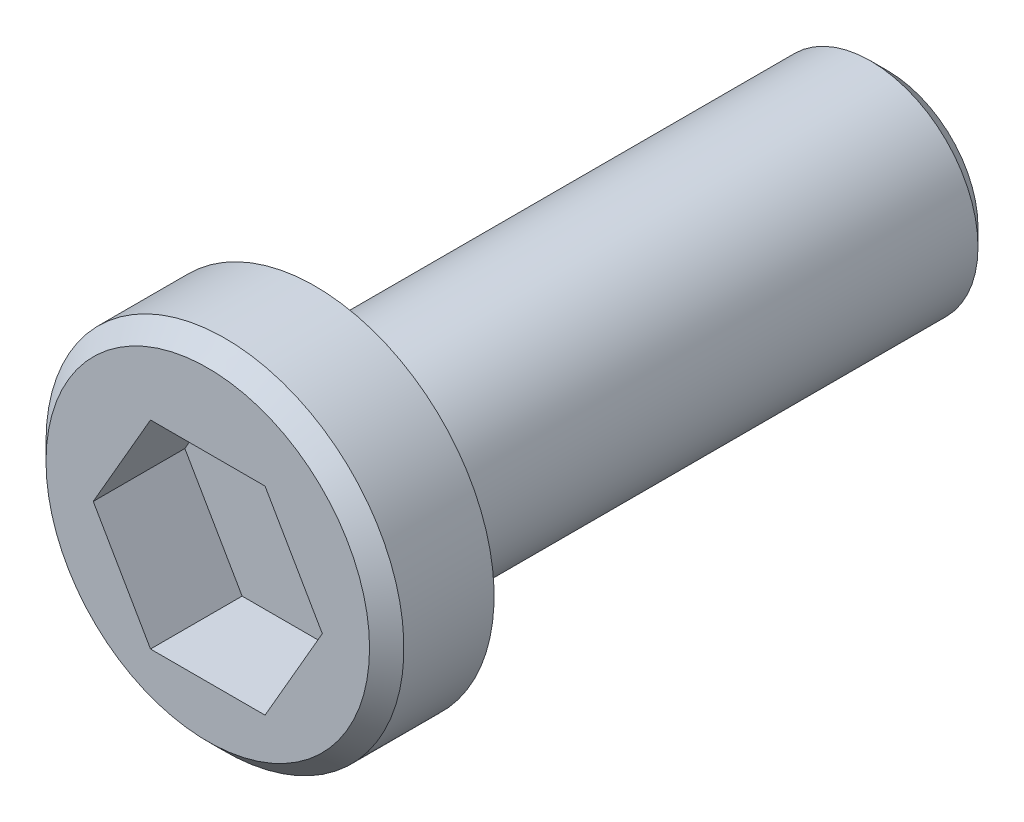
ISO-10303-21;
HEADER;
FILE_DESCRIPTION(('STEP AP214'),'2;1');
FILE_NAME('part.step','',(''),(''),'','','');
FILE_SCHEMA(('AUTOMOTIVE_DESIGN { 1 0 10303 214 1 1 1 1 }'));
ENDSEC;
DATA;
#1=APPLICATION_CONTEXT('core data for automotive mechanical design processes');
#2=APPLICATION_PROTOCOL_DEFINITION('international standard','automotive_design',2000,#1);
#3=PRODUCT_CONTEXT('',#1,'mechanical');
#4=PRODUCT('Part','Part','',(#3));
#5=PRODUCT_RELATED_PRODUCT_CATEGORY('part','',(#4));
#6=PRODUCT_DEFINITION_FORMATION('','',#4);
#7=PRODUCT_DEFINITION_CONTEXT('part definition',#1,'design');
#8=PRODUCT_DEFINITION('design','',#6,#7);
#9=PRODUCT_DEFINITION_SHAPE('','',#8);
#10=(LENGTH_UNIT() NAMED_UNIT(*) SI_UNIT(.MILLI.,.METRE.));
#11=(NAMED_UNIT(*) PLANE_ANGLE_UNIT() SI_UNIT($,.RADIAN.));
#12=(NAMED_UNIT(*) SI_UNIT($,.STERADIAN.) SOLID_ANGLE_UNIT());
#13=UNCERTAINTY_MEASURE_WITH_UNIT(LENGTH_MEASURE(1.E-05),#10,'distance_accuracy_value','');
#14=(GEOMETRIC_REPRESENTATION_CONTEXT(3) GLOBAL_UNCERTAINTY_ASSIGNED_CONTEXT((#13)) GLOBAL_UNIT_ASSIGNED_CONTEXT((#10,
#11,#12)) REPRESENTATION_CONTEXT('',''));
#15=CARTESIAN_POINT('',(0.,0.,0.));
#16=DIRECTION('',(0.,0.,1.));
#17=DIRECTION('',(1.,0.,0.));
#18=AXIS2_PLACEMENT_3D('',#15,#16,#17);
#19=CARTESIAN_POINT('',(0.,0.,25.4));
#20=DIRECTION('',(0.,0.,-1.));
#21=DIRECTION('',(-1.,0.,0.));
#22=AXIS2_PLACEMENT_3D('',#19,#20,#21);
#23=CYLINDRICAL_SURFACE('',#22,4.7625);
#24=CARTESIAN_POINT('',(0.,0.,0.761999999999999));
#25=DIRECTION('',(0.,0.,1.));
#26=DIRECTION('',(1.,0.,0.));
#27=AXIS2_PLACEMENT_3D('',#24,#25,#26);
#28=CIRCLE('',#27,4.7625);
#29=CARTESIAN_POINT('',(4.7625,0.,0.761999999999999));
#30=VERTEX_POINT('',#29);
#31=EDGE_CURVE('E161',#30,#30,#28,.T.);
#32=ORIENTED_EDGE('',*,*,#31,.T.);
#33=EDGE_LOOP('',(#32));
#34=FACE_BOUND('',#33,.T.);
#35=CARTESIAN_POINT('',(0.,0.,25.4));
#36=DIRECTION('',(0.,0.,1.));
#37=DIRECTION('',(1.,0.,0.));
#38=AXIS2_PLACEMENT_3D('',#35,#36,#37);
#39=CIRCLE('',#38,4.7625);
#40=CARTESIAN_POINT('',(4.7625,0.,25.4));
#41=VERTEX_POINT('',#40);
#42=EDGE_CURVE('E158',#41,#41,#39,.T.);
#43=ORIENTED_EDGE('',*,*,#42,.F.);
#44=EDGE_LOOP('',(#43));
#45=FACE_BOUND('',#44,.T.);
#46=ADVANCED_FACE('F46',(#34,#45),#23,.T.);
#47=CARTESIAN_POINT('',(0.,0.,0.));
#48=DIRECTION('',(0.,0.,1.));
#49=DIRECTION('',(1.,0.,0.));
#50=AXIS2_PLACEMENT_3D('',#47,#48,#49);
#51=PLANE('',#50);
#52=CARTESIAN_POINT('',(0.,0.,0.));
#53=DIRECTION('',(0.,0.,1.));
#54=DIRECTION('',(1.,0.,0.));
#55=AXIS2_PLACEMENT_3D('',#52,#53,#54);
#56=CIRCLE('',#55,4.0005);
#57=CARTESIAN_POINT('',(4.0005,0.,0.));
#58=VERTEX_POINT('',#57);
#59=EDGE_CURVE('E164',#58,#58,#56,.F.);
#60=ORIENTED_EDGE('',*,*,#59,.T.);
#61=EDGE_LOOP('',(#60));
#62=FACE_BOUND('',#61,.T.);
#63=ADVANCED_FACE('F185',(#62),#51,.F.);
#64=CARTESIAN_POINT('',(0.,0.491553117569765,25.4));
#65=DIRECTION('',(0.,0.,1.));
#66=DIRECTION('',(1.,0.,0.));
#67=AXIS2_PLACEMENT_3D('',#64,#65,#66);
#68=PLANE('',#67);
#69=CARTESIAN_POINT('',(0.,0.491553117569765,25.4));
#70=DIRECTION('',(0.,0.,1.));
#71=DIRECTION('',(1.,0.,0.));
#72=AXIS2_PLACEMENT_3D('',#69,#70,#71);
#73=CIRCLE('',#72,7.9375);
#74=CARTESIAN_POINT('',(-7.9375,0.491553117569765,25.4));
#75=VERTEX_POINT('',#74);
#76=EDGE_CURVE('E149',#75,#75,#73,.T.);
#77=ORIENTED_EDGE('',*,*,#76,.F.);
#78=EDGE_LOOP('',(#77));
#79=FACE_BOUND('',#78,.T.);
#80=ORIENTED_EDGE('',*,*,#42,.T.);
#81=EDGE_LOOP('',(#80));
#82=FACE_BOUND('',#81,.T.);
#83=ADVANCED_FACE('F190',(#79,#82),#68,.F.);
#84=CARTESIAN_POINT('',(0.,0.491553117569765,30.1625));
#85=DIRECTION('',(0.,0.,-1.));
#86=DIRECTION('',(-1.,0.,0.));
#87=AXIS2_PLACEMENT_3D('',#84,#85,#86);
#88=CYLINDRICAL_SURFACE('',#87,7.9375);
#89=CARTESIAN_POINT('',(0.,0.491553117569765,29.4005));
#90=DIRECTION('',(0.,0.,1.));
#91=DIRECTION('',(1.,0.,0.));
#92=AXIS2_PLACEMENT_3D('',#89,#90,#91);
#93=CIRCLE('',#92,7.9375);
#94=CARTESIAN_POINT('',(-7.9375,0.491553117569765,29.4005));
#95=VERTEX_POINT('',#94);
#96=EDGE_CURVE('E13',#95,#95,#93,.F.);
#97=CARTESIAN_POINT('',(-7.9375,0.491553117569765,29.4005));
#98=CARTESIAN_POINT('',(-7.9375,0.491553117569765,29.358828125));
#99=CARTESIAN_POINT('',(-7.9375,0.491553117569765,29.31715625));
#100=CARTESIAN_POINT('',(-7.9375,0.491553117569765,29.2338125));
#101=CARTESIAN_POINT('',(-7.9375,0.491553117569765,29.192140625));
#102=CARTESIAN_POINT('',(-7.9375,0.491553117569765,29.108796875));
#103=CARTESIAN_POINT('',(-7.9375,0.491553117569765,29.067125));
#104=CARTESIAN_POINT('',(-7.9375,0.491553117569765,28.98378125));
#105=CARTESIAN_POINT('',(-7.9375,0.491553117569765,28.942109375));
#106=CARTESIAN_POINT('',(-7.9375,0.491553117569765,28.858765625));
#107=CARTESIAN_POINT('',(-7.9375,0.491553117569765,28.81709375));
#108=CARTESIAN_POINT('',(-7.9375,0.491553117569765,28.73375));
#109=CARTESIAN_POINT('',(-7.9375,0.491553117569765,28.692078125));
#110=CARTESIAN_POINT('',(-7.9375,0.491553117569765,28.608734375));
#111=CARTESIAN_POINT('',(-7.9375,0.491553117569765,28.5670625));
#112=CARTESIAN_POINT('',(-7.9375,0.491553117569765,28.48371875));
#113=CARTESIAN_POINT('',(-7.9375,0.491553117569765,28.442046875));
#114=CARTESIAN_POINT('',(-7.9375,0.491553117569765,28.358703125));
#115=CARTESIAN_POINT('',(-7.9375,0.491553117569765,28.31703125));
#116=CARTESIAN_POINT('',(-7.9375,0.491553117569765,28.2336875));
#117=CARTESIAN_POINT('',(-7.9375,0.491553117569765,28.192015625));
#118=CARTESIAN_POINT('',(-7.9375,0.491553117569765,28.108671875));
#119=CARTESIAN_POINT('',(-7.9375,0.491553117569765,28.067));
#120=CARTESIAN_POINT('',(-7.9375,0.491553117569765,27.98365625));
#121=CARTESIAN_POINT('',(-7.9375,0.491553117569765,27.941984375));
#122=CARTESIAN_POINT('',(-7.9375,0.491553117569765,27.858640625));
#123=CARTESIAN_POINT('',(-7.9375,0.491553117569765,27.81696875));
#124=CARTESIAN_POINT('',(-7.9375,0.491553117569765,27.733625));
#125=CARTESIAN_POINT('',(-7.9375,0.491553117569765,27.691953125));
#126=CARTESIAN_POINT('',(-7.9375,0.491553117569765,27.608609375));
#127=CARTESIAN_POINT('',(-7.9375,0.491553117569765,27.5669375));
#128=CARTESIAN_POINT('',(-7.9375,0.491553117569765,27.48359375));
#129=CARTESIAN_POINT('',(-7.9375,0.491553117569765,27.441921875));
#130=CARTESIAN_POINT('',(-7.9375,0.491553117569765,27.358578125));
#131=CARTESIAN_POINT('',(-7.9375,0.491553117569765,27.31690625));
#132=CARTESIAN_POINT('',(-7.9375,0.491553117569765,27.2335625));
#133=CARTESIAN_POINT('',(-7.9375,0.491553117569765,27.191890625));
#134=CARTESIAN_POINT('',(-7.9375,0.491553117569765,27.108546875));
#135=CARTESIAN_POINT('',(-7.9375,0.491553117569765,27.066875));
#136=CARTESIAN_POINT('',(-7.9375,0.491553117569765,26.98353125));
#137=CARTESIAN_POINT('',(-7.9375,0.491553117569765,26.941859375));
#138=CARTESIAN_POINT('',(-7.9375,0.491553117569765,26.858515625));
#139=CARTESIAN_POINT('',(-7.9375,0.491553117569765,26.81684375));
#140=CARTESIAN_POINT('',(-7.9375,0.491553117569765,26.7335));
#141=CARTESIAN_POINT('',(-7.9375,0.491553117569765,26.691828125));
#142=CARTESIAN_POINT('',(-7.9375,0.491553117569765,26.608484375));
#143=CARTESIAN_POINT('',(-7.9375,0.491553117569765,26.5668125));
#144=CARTESIAN_POINT('',(-7.9375,0.491553117569765,26.48346875));
#145=CARTESIAN_POINT('',(-7.9375,0.491553117569765,26.441796875));
#146=CARTESIAN_POINT('',(-7.9375,0.491553117569765,26.358453125));
#147=CARTESIAN_POINT('',(-7.9375,0.491553117569765,26.31678125));
#148=CARTESIAN_POINT('',(-7.9375,0.491553117569765,26.2334375));
#149=CARTESIAN_POINT('',(-7.9375,0.491553117569765,26.191765625));
#150=CARTESIAN_POINT('',(-7.9375,0.491553117569765,26.108421875));
#151=CARTESIAN_POINT('',(-7.9375,0.491553117569765,26.06675));
#152=CARTESIAN_POINT('',(-7.9375,0.491553117569765,25.98340625));
#153=CARTESIAN_POINT('',(-7.9375,0.491553117569765,25.941734375));
#154=CARTESIAN_POINT('',(-7.9375,0.491553117569765,25.858390625));
#155=CARTESIAN_POINT('',(-7.9375,0.491553117569765,25.81671875));
#156=CARTESIAN_POINT('',(-7.9375,0.491553117569765,25.733375));
#157=CARTESIAN_POINT('',(-7.9375,0.491553117569765,25.691703125));
#158=CARTESIAN_POINT('',(-7.9375,0.491553117569765,25.608359375));
#159=CARTESIAN_POINT('',(-7.9375,0.491553117569765,25.5666875));
#160=CARTESIAN_POINT('',(-7.9375,0.491553117569765,25.48334375));
#161=CARTESIAN_POINT('',(-7.9375,0.491553117569765,25.441671875));
#162=CARTESIAN_POINT('',(-7.9375,0.491553117569765,25.4));
#163=B_SPLINE_CURVE_WITH_KNOTS('',3,(#97,#98,#99,#100,#101,#102,#103,#104,#105,#106,#107,#108,
#109,#110,#111,#112,#113,#114,#115,#116,#117,#118,#119,#120,#121,#122,#123,#124,#125,#126,#127,
#128,#129,#130,#131,#132,#133,#134,#135,#136,#137,#138,#139,#140,#141,#142,#143,#144,#145,#146,
#147,#148,#149,#150,#151,#152,#153,#154,#155,#156,#157,#158,#159,#160,#161,#162),.UNSPECIFIED.,
.F.,.F.,(4,2,2,2,2,2,2,2,2,2,2,2,2,2,2,2,2,2,2,2,2,2,2,2,2,2,2,2,2,2,2,2,4),(0.,
0.125015625000002,0.250031250000001,0.375046875000003,0.500062500000002,0.625078125000001,
0.750093750000003,0.875109375000002,1.000125,1.125140625,1.25015625,1.375171875,1.5001875,
1.625203125,1.75021875,1.875234375,2.00025,2.125265625,2.25028125,2.375296875,2.5003125,
2.625328125,2.75034375,2.875359375,3.000375,3.125390625,3.25040625,3.375421875,3.5004375,
3.625453125,3.75046875,3.875484375,4.0005),.UNSPECIFIED.);
#164=EDGE_CURVE('BSEAM197',#95,#75,#163,.T.);
#165=ORIENTED_EDGE('',*,*,#96,.T.);
#166=ORIENTED_EDGE('',*,*,#76,.T.);
#167=ORIENTED_EDGE('',*,*,#164,.T.);
#168=ORIENTED_EDGE('',*,*,#164,.F.);
#169=EDGE_LOOP('',(#165,#167,#166,#168));
#170=FACE_BOUND('',#169,.T.);
#171=ADVANCED_FACE('F197',(#170),#88,.T.);
#172=CARTESIAN_POINT('',(0.,0.491553117569765,30.1625));
#173=DIRECTION('',(0.,0.,1.));
#174=DIRECTION('',(1.,0.,0.));
#175=AXIS2_PLACEMENT_3D('',#172,#173,#174);
#176=PLANE('',#175);
#177=DIRECTION('',(1.,0.,0.));
#178=VECTOR('',#177,1.);
#179=CARTESIAN_POINT('',(-2.54,-4.39940905122495,30.1625));
#180=LINE('',#179,#178);
#181=CARTESIAN_POINT('',(-2.54,-4.39940905122495,30.1625));
#182=VERTEX_POINT('',#181);
#183=CARTESIAN_POINT('',(2.54,-4.39940905122495,30.1625));
#184=VERTEX_POINT('',#183);
#185=EDGE_CURVE('E131',#182,#184,#180,.T.);
#186=ORIENTED_EDGE('',*,*,#185,.F.);
#187=DIRECTION('',(0.5,-0.866025403784438,0.));
#188=VECTOR('',#187,1.);
#189=CARTESIAN_POINT('',(-5.08,0.,30.1625));
#190=LINE('',#189,#188);
#191=CARTESIAN_POINT('',(-5.08,0.,30.1625));
#192=VERTEX_POINT('',#191);
#193=EDGE_CURVE('E125',#192,#182,#190,.T.);
#194=ORIENTED_EDGE('',*,*,#193,.F.);
#195=DIRECTION('',(-0.5,-0.866025403784439,0.));
#196=VECTOR('',#195,1.);
#197=CARTESIAN_POINT('',(-2.54,4.39940905122495,30.1625));
#198=LINE('',#197,#196);
#199=CARTESIAN_POINT('',(-2.54,4.39940905122495,30.1625));
#200=VERTEX_POINT('',#199);
#201=EDGE_CURVE('E123',#200,#192,#198,.T.);
#202=ORIENTED_EDGE('',*,*,#201,.F.);
#203=DIRECTION('',(-1.,0.,0.));
#204=VECTOR('',#203,1.);
#205=CARTESIAN_POINT('',(2.54,4.39940905122495,30.1625));
#206=LINE('',#205,#204);
#207=CARTESIAN_POINT('',(2.54,4.39940905122495,30.1625));
#208=VERTEX_POINT('',#207);
#209=EDGE_CURVE('E103',#208,#200,#206,.T.);
#210=ORIENTED_EDGE('',*,*,#209,.F.);
#211=DIRECTION('',(-0.5,0.866025403784438,0.));
#212=VECTOR('',#211,1.);
#213=CARTESIAN_POINT('',(5.08,0.,30.1625));
#214=LINE('',#213,#212);
#215=CARTESIAN_POINT('',(5.08,0.,30.1625));
#216=VERTEX_POINT('',#215);
#217=EDGE_CURVE('E114',#216,#208,#214,.T.);
#218=ORIENTED_EDGE('',*,*,#217,.F.);
#219=DIRECTION('',(0.499999999999999,0.866025403784439,0.));
#220=VECTOR('',#219,1.);
#221=CARTESIAN_POINT('',(2.54,-4.39940905122495,30.1625));
#222=LINE('',#221,#220);
#223=EDGE_CURVE('E60',#184,#216,#222,.T.);
#224=ORIENTED_EDGE('',*,*,#223,.F.);
#225=EDGE_LOOP('',(#186,#194,#202,#210,#218,#224));
#226=FACE_BOUND('',#225,.T.);
#227=CARTESIAN_POINT('',(0.,0.491553117569765,30.1625));
#228=DIRECTION('',(0.,0.,1.));
#229=DIRECTION('',(1.,0.,0.));
#230=AXIS2_PLACEMENT_3D('',#227,#228,#229);
#231=CIRCLE('',#230,7.1755);
#232=CARTESIAN_POINT('',(7.1755,0.491553117569765,30.1625));
#233=VERTEX_POINT('',#232);
#234=EDGE_CURVE('E53',#233,#233,#231,.T.);
#235=ORIENTED_EDGE('',*,*,#234,.T.);
#236=EDGE_LOOP('',(#235));
#237=FACE_BOUND('',#236,.T.);
#238=ADVANCED_FACE('F119',(#226,#237),#176,.T.);
#239=CARTESIAN_POINT('',(0.,0.,0.761999999999999));
#240=DIRECTION('',(0.,0.,1.));
#241=DIRECTION('',(1.,0.,0.));
#242=AXIS2_PLACEMENT_3D('',#239,#240,#241);
#243=CONICAL_SURFACE('',#242,4.7625,0.785398163397451);
#244=ORIENTED_EDGE('',*,*,#59,.F.);
#245=EDGE_LOOP('',(#244));
#246=FACE_BOUND('',#245,.T.);
#247=ORIENTED_EDGE('',*,*,#31,.F.);
#248=EDGE_LOOP('',(#247));
#249=FACE_BOUND('',#248,.T.);
#250=ADVANCED_FACE('F172',(#246,#249),#243,.T.);
#251=CARTESIAN_POINT('',(0.,0.491553117569765,30.1625));
#252=DIRECTION('',(0.,0.,-1.));
#253=DIRECTION('',(-1.,0.,0.));
#254=AXIS2_PLACEMENT_3D('',#251,#252,#253);
#255=CONICAL_SURFACE('',#254,7.1755,0.785398163397448);
#256=ORIENTED_EDGE('',*,*,#96,.F.);
#257=EDGE_LOOP('',(#256));
#258=FACE_BOUND('',#257,.T.);
#259=ORIENTED_EDGE('',*,*,#234,.F.);
#260=EDGE_LOOP('',(#259));
#261=FACE_BOUND('',#260,.T.);
#262=ADVANCED_FACE('F169',(#258,#261),#255,.T.);
#263=CARTESIAN_POINT('',(2.54,-4.39940905122495,26.0985));
#264=DIRECTION('',(0.866025403784439,-0.5,0.));
#265=DIRECTION('',(0.5,0.866025403784439,0.));
#266=AXIS2_PLACEMENT_3D('',#263,#264,#265);
#267=PLANE('',#266);
#268=ORIENTED_EDGE('',*,*,#223,.T.);
#269=DIRECTION('',(0.,0.,1.));
#270=VECTOR('',#269,1.);
#271=CARTESIAN_POINT('',(5.08,0.,26.0985));
#272=LINE('',#271,#270);
#273=CARTESIAN_POINT('',(5.08,0.,26.0985));
#274=VERTEX_POINT('',#273);
#275=EDGE_CURVE('E111',#274,#216,#272,.T.);
#276=ORIENTED_EDGE('',*,*,#275,.F.);
#277=DIRECTION('',(0.499999999999999,0.866025403784439,0.));
#278=VECTOR('',#277,1.);
#279=CARTESIAN_POINT('',(2.54,-4.39940905122495,26.0985));
#280=LINE('',#279,#278);
#281=CARTESIAN_POINT('',(2.54,-4.39940905122495,26.0985));
#282=VERTEX_POINT('',#281);
#283=EDGE_CURVE('E133',#282,#274,#280,.T.);
#284=ORIENTED_EDGE('',*,*,#283,.F.);
#285=DIRECTION('',(0.,0.,1.));
#286=VECTOR('',#285,1.);
#287=CARTESIAN_POINT('',(2.54,-4.39940905122495,26.0985));
#288=LINE('',#287,#286);
#289=EDGE_CURVE('E67',#282,#184,#288,.T.);
#290=ORIENTED_EDGE('',*,*,#289,.T.);
#291=EDGE_LOOP('',(#268,#276,#284,#290));
#292=FACE_BOUND('',#291,.T.);
#293=ADVANCED_FACE('F171',(#292),#267,.F.);
#294=CARTESIAN_POINT('',(-2.54,-4.39940905122495,26.0985));
#295=DIRECTION('',(0.,-1.,0.));
#296=DIRECTION('',(1.,0.,0.));
#297=AXIS2_PLACEMENT_3D('',#294,#295,#296);
#298=PLANE('',#297);
#299=ORIENTED_EDGE('',*,*,#185,.T.);
#300=ORIENTED_EDGE('',*,*,#289,.F.);
#301=DIRECTION('',(1.,0.,0.));
#302=VECTOR('',#301,1.);
#303=CARTESIAN_POINT('',(-2.54,-4.39940905122495,26.0985));
#304=LINE('',#303,#302);
#305=CARTESIAN_POINT('',(-2.54,-4.39940905122495,26.0985));
#306=VERTEX_POINT('',#305);
#307=EDGE_CURVE('E145',#306,#282,#304,.T.);
#308=ORIENTED_EDGE('',*,*,#307,.F.);
#309=DIRECTION('',(0.,0.,1.));
#310=VECTOR('',#309,1.);
#311=CARTESIAN_POINT('',(-2.54,-4.39940905122495,26.0985));
#312=LINE('',#311,#310);
#313=EDGE_CURVE('E150',#306,#182,#312,.T.);
#314=ORIENTED_EDGE('',*,*,#313,.T.);
#315=EDGE_LOOP('',(#299,#300,#308,#314));
#316=FACE_BOUND('',#315,.T.);
#317=ADVANCED_FACE('F179',(#316),#298,.F.);
#318=CARTESIAN_POINT('',(-5.08,0.,26.0985));
#319=DIRECTION('',(-0.866025403784439,-0.5,0.));
#320=DIRECTION('',(0.5,-0.866025403784439,0.));
#321=AXIS2_PLACEMENT_3D('',#318,#319,#320);
#322=PLANE('',#321);
#323=ORIENTED_EDGE('',*,*,#193,.T.);
#324=ORIENTED_EDGE('',*,*,#313,.F.);
#325=DIRECTION('',(0.5,-0.866025403784438,0.));
#326=VECTOR('',#325,1.);
#327=CARTESIAN_POINT('',(-5.08,0.,26.0985));
#328=LINE('',#327,#326);
#329=CARTESIAN_POINT('',(-5.08,0.,26.0985));
#330=VERTEX_POINT('',#329);
#331=EDGE_CURVE('E142',#330,#306,#328,.T.);
#332=ORIENTED_EDGE('',*,*,#331,.F.);
#333=DIRECTION('',(0.,0.,1.));
#334=VECTOR('',#333,1.);
#335=CARTESIAN_POINT('',(-5.08,0.,26.0985));
#336=LINE('',#335,#334);
#337=EDGE_CURVE('E152',#330,#192,#336,.T.);
#338=ORIENTED_EDGE('',*,*,#337,.T.);
#339=EDGE_LOOP('',(#323,#324,#332,#338));
#340=FACE_BOUND('',#339,.T.);
#341=ADVANCED_FACE('F238',(#340),#322,.F.);
#342=CARTESIAN_POINT('',(-2.54,4.39940905122495,26.0985));
#343=DIRECTION('',(-0.866025403784439,0.5,0.));
#344=DIRECTION('',(-0.5,-0.866025403784439,0.));
#345=AXIS2_PLACEMENT_3D('',#342,#343,#344);
#346=PLANE('',#345);
#347=ORIENTED_EDGE('',*,*,#201,.T.);
#348=ORIENTED_EDGE('',*,*,#337,.F.);
#349=DIRECTION('',(-0.5,-0.866025403784439,0.));
#350=VECTOR('',#349,1.);
#351=CARTESIAN_POINT('',(-2.54,4.39940905122495,26.0985));
#352=LINE('',#351,#350);
#353=CARTESIAN_POINT('',(-2.54,4.39940905122495,26.0985));
#354=VERTEX_POINT('',#353);
#355=EDGE_CURVE('E139',#354,#330,#352,.T.);
#356=ORIENTED_EDGE('',*,*,#355,.F.);
#357=DIRECTION('',(0.,0.,1.));
#358=VECTOR('',#357,1.);
#359=CARTESIAN_POINT('',(-2.54,4.39940905122495,26.0985));
#360=LINE('',#359,#358);
#361=EDGE_CURVE('E110',#354,#200,#360,.T.);
#362=ORIENTED_EDGE('',*,*,#361,.T.);
#363=EDGE_LOOP('',(#347,#348,#356,#362));
#364=FACE_BOUND('',#363,.T.);
#365=ADVANCED_FACE('F246',(#364),#346,.F.);
#366=CARTESIAN_POINT('',(2.54,4.39940905122495,26.0985));
#367=DIRECTION('',(0.,1.,0.));
#368=DIRECTION('',(0.,0.,1.));
#369=AXIS2_PLACEMENT_3D('',#366,#367,#368);
#370=PLANE('',#369);
#371=ORIENTED_EDGE('',*,*,#209,.T.);
#372=ORIENTED_EDGE('',*,*,#361,.F.);
#373=DIRECTION('',(-1.,0.,0.));
#374=VECTOR('',#373,1.);
#375=CARTESIAN_POINT('',(2.54,4.39940905122495,26.0985));
#376=LINE('',#375,#374);
#377=CARTESIAN_POINT('',(2.54,4.39940905122495,26.0985));
#378=VERTEX_POINT('',#377);
#379=EDGE_CURVE('E106',#378,#354,#376,.T.);
#380=ORIENTED_EDGE('',*,*,#379,.F.);
#381=DIRECTION('',(0.,0.,1.));
#382=VECTOR('',#381,1.);
#383=CARTESIAN_POINT('',(2.54,4.39940905122495,26.0985));
#384=LINE('',#383,#382);
#385=EDGE_CURVE('E99',#378,#208,#384,.T.);
#386=ORIENTED_EDGE('',*,*,#385,.T.);
#387=EDGE_LOOP('',(#371,#372,#380,#386));
#388=FACE_BOUND('',#387,.T.);
#389=ADVANCED_FACE('F101',(#388),#370,.F.);
#390=CARTESIAN_POINT('',(5.08,0.,26.0985));
#391=DIRECTION('',(0.866025403784438,0.5,0.));
#392=DIRECTION('',(-0.5,0.866025403784439,0.));
#393=AXIS2_PLACEMENT_3D('',#390,#391,#392);
#394=PLANE('',#393);
#395=ORIENTED_EDGE('',*,*,#217,.T.);
#396=ORIENTED_EDGE('',*,*,#385,.F.);
#397=DIRECTION('',(-0.5,0.866025403784438,0.));
#398=VECTOR('',#397,1.);
#399=CARTESIAN_POINT('',(5.08,0.,26.0985));
#400=LINE('',#399,#398);
#401=EDGE_CURVE('E136',#274,#378,#400,.T.);
#402=ORIENTED_EDGE('',*,*,#401,.F.);
#403=ORIENTED_EDGE('',*,*,#275,.T.);
#404=EDGE_LOOP('',(#395,#396,#402,#403));
#405=FACE_BOUND('',#404,.T.);
#406=ADVANCED_FACE('F115',(#405),#394,.F.);
#407=CARTESIAN_POINT('',(7.62,4.39940905122495,26.0985));
#408=DIRECTION('',(0.,0.,1.));
#409=DIRECTION('',(1.,0.,0.));
#410=AXIS2_PLACEMENT_3D('',#407,#408,#409);
#411=PLANE('',#410);
#412=ORIENTED_EDGE('',*,*,#283,.T.);
#413=ORIENTED_EDGE('',*,*,#401,.T.);
#414=ORIENTED_EDGE('',*,*,#379,.T.);
#415=ORIENTED_EDGE('',*,*,#355,.T.);
#416=ORIENTED_EDGE('',*,*,#331,.T.);
#417=ORIENTED_EDGE('',*,*,#307,.T.);
#418=EDGE_LOOP('',(#412,#413,#414,#415,#416,#417));
#419=FACE_BOUND('',#418,.T.);
#420=ADVANCED_FACE('F270',(#419),#411,.T.);
#421=CLOSED_SHELL('',(#46,#63,#83,#171,#238,#250,#262,#293,#317,#341,#365,#389,#406,#420));
#422=MANIFOLD_SOLID_BREP('B2',#421);
#423=ADVANCED_BREP_SHAPE_REPRESENTATION('',(#18,#422),#14);
#424=SHAPE_DEFINITION_REPRESENTATION(#9,#423);
ENDSEC;
END-ISO-10303-21;
